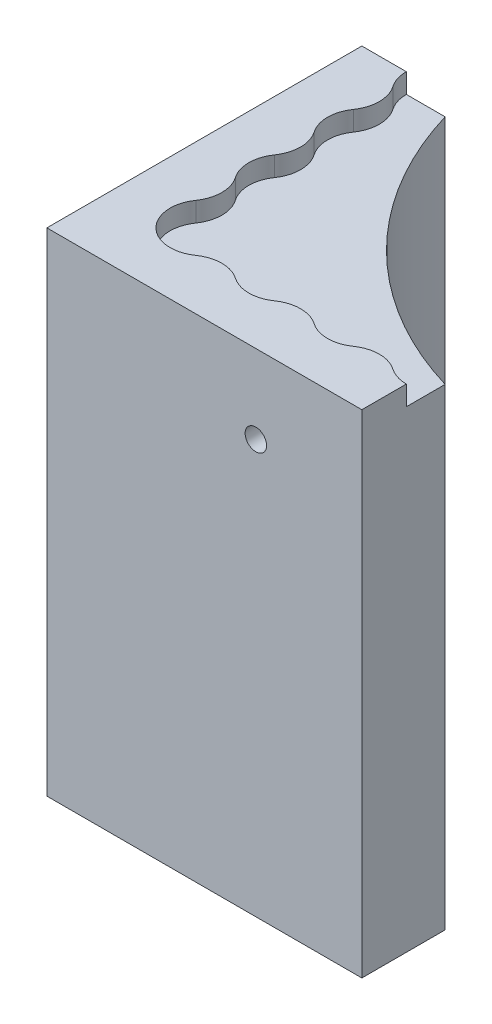
ISO-10303-21;
HEADER;
FILE_DESCRIPTION(('STEP AP214'),'2;1');
FILE_NAME('part.step','',(''),(''),'','','');
FILE_SCHEMA(('AUTOMOTIVE_DESIGN { 1 0 10303 214 1 1 1 1 }'));
ENDSEC;
DATA;
#1=APPLICATION_CONTEXT('core data for automotive mechanical design processes');
#2=APPLICATION_PROTOCOL_DEFINITION('international standard','automotive_design',2000,#1);
#3=PRODUCT_CONTEXT('',#1,'mechanical');
#4=PRODUCT('Part','Part','',(#3));
#5=PRODUCT_RELATED_PRODUCT_CATEGORY('part','',(#4));
#6=PRODUCT_DEFINITION_FORMATION('','',#4);
#7=PRODUCT_DEFINITION_CONTEXT('part definition',#1,'design');
#8=PRODUCT_DEFINITION('design','',#6,#7);
#9=PRODUCT_DEFINITION_SHAPE('','',#8);
#10=(LENGTH_UNIT() NAMED_UNIT(*) SI_UNIT(.MILLI.,.METRE.));
#11=(NAMED_UNIT(*) PLANE_ANGLE_UNIT() SI_UNIT($,.RADIAN.));
#12=(NAMED_UNIT(*) SI_UNIT($,.STERADIAN.) SOLID_ANGLE_UNIT());
#13=UNCERTAINTY_MEASURE_WITH_UNIT(LENGTH_MEASURE(1.E-05),#10,'distance_accuracy_value','');
#14=(GEOMETRIC_REPRESENTATION_CONTEXT(3) GLOBAL_UNCERTAINTY_ASSIGNED_CONTEXT((#13)) GLOBAL_UNIT_ASSIGNED_CONTEXT((#10,
#11,#12)) REPRESENTATION_CONTEXT('',''));
#15=CARTESIAN_POINT('',(0.,0.,0.));
#16=DIRECTION('',(0.,0.,1.));
#17=DIRECTION('',(1.,0.,0.));
#18=AXIS2_PLACEMENT_3D('',#15,#16,#17);
#19=CARTESIAN_POINT('',(0.,79.375,0.));
#20=DIRECTION('',(1.,0.,0.));
#21=DIRECTION('',(0.,0.,-1.));
#22=AXIS2_PLACEMENT_3D('',#19,#20,#21);
#23=PLANE('',#22);
#24=CARTESIAN_POINT('',(1.05619764983864E-13,66.6750000000001,-33.7000000000002));
#25=DIRECTION('',(-1.,0.,0.));
#26=DIRECTION('',(0.,0.,1.));
#27=AXIS2_PLACEMENT_3D('',#24,#25,#26);
#28=CIRCLE('',#27,1.7272);
#29=CARTESIAN_POINT('',(1.05471727593493E-13,66.6750000000001,-31.9728000000002));
#30=VERTEX_POINT('',#29);
#31=EDGE_CURVE('E217',#30,#30,#28,.T.);
#32=ORIENTED_EDGE('',*,*,#31,.F.);
#33=EDGE_LOOP('',(#32));
#34=FACE_BOUND('',#33,.T.);
#35=DIRECTION('',(0.,0.,1.));
#36=VECTOR('',#35,1.);
#37=CARTESIAN_POINT('',(0.,0.,0.));
#38=LINE('',#37,#36);
#39=CARTESIAN_POINT('',(0.,0.,-50.8));
#40=VERTEX_POINT('',#39);
#41=CARTESIAN_POINT('',(0.,0.,0.));
#42=VERTEX_POINT('',#41);
#43=EDGE_CURVE('E375',#40,#42,#38,.T.);
#44=ORIENTED_EDGE('',*,*,#43,.T.);
#45=DIRECTION('',(0.,-1.,0.));
#46=VECTOR('',#45,1.);
#47=CARTESIAN_POINT('',(0.,79.375,0.));
#48=LINE('',#47,#46);
#49=CARTESIAN_POINT('',(0.,79.375,0.));
#50=VERTEX_POINT('',#49);
#51=EDGE_CURVE('E409',#50,#42,#48,.T.);
#52=ORIENTED_EDGE('',*,*,#51,.F.);
#53=DIRECTION('',(0.,0.,1.));
#54=VECTOR('',#53,1.);
#55=CARTESIAN_POINT('',(0.,79.375,0.));
#56=LINE('',#55,#54);
#57=CARTESIAN_POINT('',(0.,79.375,-50.8));
#58=VERTEX_POINT('',#57);
#59=EDGE_CURVE('E376',#58,#50,#56,.T.);
#60=ORIENTED_EDGE('',*,*,#59,.F.);
#61=DIRECTION('',(0.,-1.,0.));
#62=VECTOR('',#61,1.);
#63=CARTESIAN_POINT('',(0.,79.375,-50.8));
#64=LINE('',#63,#62);
#65=EDGE_CURVE('E389',#58,#40,#64,.T.);
#66=ORIENTED_EDGE('',*,*,#65,.T.);
#67=EDGE_LOOP('',(#44,#52,#60,#66));
#68=FACE_BOUND('',#67,.T.);
#69=ADVANCED_FACE('F44',(#34,#68),#23,.F.);
#70=CARTESIAN_POINT('',(0.,79.375,0.));
#71=DIRECTION('',(0.,0.,-1.));
#72=DIRECTION('',(-1.,0.,0.));
#73=AXIS2_PLACEMENT_3D('',#70,#71,#72);
#74=PLANE('',#73);
#75=CARTESIAN_POINT('',(33.7,66.6750000000001,2.22080376858034E-13));
#76=DIRECTION('',(0.,0.,1.));
#77=DIRECTION('',(1.,0.,0.));
#78=AXIS2_PLACEMENT_3D('',#75,#76,#77);
#79=CIRCLE('',#78,1.7272);
#80=CARTESIAN_POINT('',(35.4271999999999,66.6750000000001,2.22080376858034E-13));
#81=VERTEX_POINT('',#80);
#82=EDGE_CURVE('E216',#81,#81,#79,.T.);
#83=ORIENTED_EDGE('',*,*,#82,.F.);
#84=EDGE_LOOP('',(#83));
#85=FACE_BOUND('',#84,.T.);
#86=DIRECTION('',(1.,0.,0.));
#87=VECTOR('',#86,1.);
#88=CARTESIAN_POINT('',(0.,0.,0.));
#89=LINE('',#88,#87);
#90=CARTESIAN_POINT('',(50.8,0.,0.));
#91=VERTEX_POINT('',#90);
#92=EDGE_CURVE('E393',#42,#91,#89,.T.);
#93=ORIENTED_EDGE('',*,*,#92,.T.);
#94=DIRECTION('',(0.,-1.,0.));
#95=VECTOR('',#94,1.);
#96=CARTESIAN_POINT('',(50.8,79.375,0.));
#97=LINE('',#96,#95);
#98=CARTESIAN_POINT('',(50.8,79.375,0.));
#99=VERTEX_POINT('',#98);
#100=EDGE_CURVE('E405',#99,#91,#97,.T.);
#101=ORIENTED_EDGE('',*,*,#100,.F.);
#102=DIRECTION('',(1.,0.,0.));
#103=VECTOR('',#102,1.);
#104=CARTESIAN_POINT('',(0.,79.375,0.));
#105=LINE('',#104,#103);
#106=EDGE_CURVE('E379',#50,#99,#105,.T.);
#107=ORIENTED_EDGE('',*,*,#106,.F.);
#108=ORIENTED_EDGE('',*,*,#51,.T.);
#109=EDGE_LOOP('',(#93,#101,#107,#108));
#110=FACE_BOUND('',#109,.T.);
#111=ADVANCED_FACE('F481',(#85,#110),#74,.F.);
#112=CARTESIAN_POINT('',(50.8,79.375,0.));
#113=DIRECTION('',(-1.,0.,0.));
#114=DIRECTION('',(0.,0.,1.));
#115=AXIS2_PLACEMENT_3D('',#112,#113,#114);
#116=PLANE('',#115);
#117=DIRECTION('',(0.,0.,-1.));
#118=VECTOR('',#117,1.);
#119=CARTESIAN_POINT('',(50.8,0.,0.));
#120=LINE('',#119,#118);
#121=CARTESIAN_POINT('',(50.8,0.,-13.4286312857863));
#122=VERTEX_POINT('',#121);
#123=EDGE_CURVE('E396',#91,#122,#120,.T.);
#124=ORIENTED_EDGE('',*,*,#123,.T.);
#125=DIRECTION('',(0.,1.,0.));
#126=VECTOR('',#125,1.);
#127=CARTESIAN_POINT('',(50.8,0.,-13.4286312857863));
#128=LINE('',#127,#126);
#129=CARTESIAN_POINT('',(50.8,76.2,-13.4286312857863));
#130=VERTEX_POINT('',#129);
#131=EDGE_CURVE('E235',#122,#130,#128,.T.);
#132=ORIENTED_EDGE('',*,*,#131,.T.);
#133=DIRECTION('',(0.,0.,-1.));
#134=VECTOR('',#133,1.);
#135=CARTESIAN_POINT('',(50.8,76.2,0.));
#136=LINE('',#135,#134);
#137=CARTESIAN_POINT('',(50.8,76.2,-7.17550000000003));
#138=VERTEX_POINT('',#137);
#139=EDGE_CURVE('E371',#138,#130,#136,.T.);
#140=ORIENTED_EDGE('',*,*,#139,.F.);
#141=DIRECTION('',(0.,1.,0.));
#142=VECTOR('',#141,1.);
#143=CARTESIAN_POINT('',(50.8,76.2,-7.17550000000003));
#144=LINE('',#143,#142);
#145=CARTESIAN_POINT('',(50.8,79.375,-7.17550000000003));
#146=VERTEX_POINT('',#145);
#147=EDGE_CURVE('E367',#138,#146,#144,.T.);
#148=ORIENTED_EDGE('',*,*,#147,.T.);
#149=DIRECTION('',(0.,0.,-1.));
#150=VECTOR('',#149,1.);
#151=CARTESIAN_POINT('',(50.8,79.375,0.));
#152=LINE('',#151,#150);
#153=EDGE_CURVE('E383',#99,#146,#152,.T.);
#154=ORIENTED_EDGE('',*,*,#153,.F.);
#155=ORIENTED_EDGE('',*,*,#100,.T.);
#156=EDGE_LOOP('',(#124,#132,#140,#148,#154,#155));
#157=FACE_BOUND('',#156,.T.);
#158=ADVANCED_FACE('F478',(#157),#116,.F.);
#159=CARTESIAN_POINT('',(0.,79.375,-50.8));
#160=DIRECTION('',(0.,0.,1.));
#161=DIRECTION('',(1.,0.,0.));
#162=AXIS2_PLACEMENT_3D('',#159,#160,#161);
#163=PLANE('',#162);
#164=DIRECTION('',(-1.,0.,0.));
#165=VECTOR('',#164,1.);
#166=CARTESIAN_POINT('',(0.,76.2,-50.8));
#167=LINE('',#166,#165);
#168=CARTESIAN_POINT('',(13.4286312857863,76.2,-50.8));
#169=VERTEX_POINT('',#168);
#170=CARTESIAN_POINT('',(7.17550000000002,76.2,-50.8));
#171=VERTEX_POINT('',#170);
#172=EDGE_CURVE('E52',#169,#171,#167,.T.);
#173=ORIENTED_EDGE('',*,*,#172,.F.);
#174=DIRECTION('',(0.,1.,0.));
#175=VECTOR('',#174,1.);
#176=CARTESIAN_POINT('',(13.4286312857863,0.,-50.8));
#177=LINE('',#176,#175);
#178=CARTESIAN_POINT('',(13.4286312857863,0.,-50.8));
#179=VERTEX_POINT('',#178);
#180=EDGE_CURVE('E58',#169,#179,#177,.F.);
#181=ORIENTED_EDGE('',*,*,#180,.T.);
#182=DIRECTION('',(-1.,0.,0.));
#183=VECTOR('',#182,1.);
#184=CARTESIAN_POINT('',(0.,0.,-50.8));
#185=LINE('',#184,#183);
#186=EDGE_CURVE('E380',#179,#40,#185,.T.);
#187=ORIENTED_EDGE('',*,*,#186,.T.);
#188=ORIENTED_EDGE('',*,*,#65,.F.);
#189=DIRECTION('',(-1.,0.,0.));
#190=VECTOR('',#189,1.);
#191=CARTESIAN_POINT('',(0.,79.375,-50.8));
#192=LINE('',#191,#190);
#193=CARTESIAN_POINT('',(7.17550000000002,79.375,-50.8));
#194=VERTEX_POINT('',#193);
#195=EDGE_CURVE('E387',#194,#58,#192,.T.);
#196=ORIENTED_EDGE('',*,*,#195,.F.);
#197=DIRECTION('',(0.,1.,0.));
#198=VECTOR('',#197,1.);
#199=CARTESIAN_POINT('',(7.17550000000002,76.2,-50.8));
#200=LINE('',#199,#198);
#201=EDGE_CURVE('E66',#194,#171,#200,.F.);
#202=ORIENTED_EDGE('',*,*,#201,.T.);
#203=EDGE_LOOP('',(#173,#181,#187,#188,#196,#202));
#204=FACE_BOUND('',#203,.T.);
#205=ADVANCED_FACE('F422',(#204),#163,.F.);
#206=CARTESIAN_POINT('',(0.,79.375,0.));
#207=DIRECTION('',(0.,-1.,0.));
#208=DIRECTION('',(0.,0.,-1.));
#209=AXIS2_PLACEMENT_3D('',#206,#207,#208);
#210=PLANE('',#209);
#211=ORIENTED_EDGE('',*,*,#153,.T.);
#212=CARTESIAN_POINT('',(50.8,79.375,-12.7));
#213=DIRECTION('',(0.,1.,0.));
#214=DIRECTION('',(0.,0.,1.));
#215=AXIS2_PLACEMENT_3D('',#212,#213,#214);
#216=CIRCLE('',#215,5.5245);
#217=CARTESIAN_POINT('',(47.6431428571429,79.375,-8.16630909417155));
#218=VERTEX_POINT('',#217);
#219=EDGE_CURVE('E243',#218,#146,#216,.T.);
#220=ORIENTED_EDGE('',*,*,#219,.F.);
#221=CARTESIAN_POINT('',(44.45,79.375,-3.58050679862091));
#222=DIRECTION('',(0.,-1.,0.));
#223=DIRECTION('',(0.,0.,1.));
#224=AXIS2_PLACEMENT_3D('',#221,#222,#223);
#225=CIRCLE('',#224,5.588);
#226=CARTESIAN_POINT('',(41.2568571428572,79.375,-8.16630909417154));
#227=VERTEX_POINT('',#226);
#228=EDGE_CURVE('E327',#227,#218,#225,.T.);
#229=ORIENTED_EDGE('',*,*,#228,.F.);
#230=CARTESIAN_POINT('',(38.1,79.375,-12.7));
#231=DIRECTION('',(0.,1.,0.));
#232=DIRECTION('',(0.,0.,1.));
#233=AXIS2_PLACEMENT_3D('',#230,#231,#232);
#234=CIRCLE('',#233,5.5245);
#235=CARTESIAN_POINT('',(34.9431428571429,79.375,-8.16630909417153));
#236=VERTEX_POINT('',#235);
#237=EDGE_CURVE('E323',#236,#227,#234,.T.);
#238=ORIENTED_EDGE('',*,*,#237,.F.);
#239=CARTESIAN_POINT('',(31.75,79.375,-3.58050679862088));
#240=DIRECTION('',(0.,-1.,0.));
#241=DIRECTION('',(0.,0.,1.));
#242=AXIS2_PLACEMENT_3D('',#239,#240,#241);
#243=CIRCLE('',#242,5.588);
#244=CARTESIAN_POINT('',(28.5568571428572,79.375,-8.16630909417152));
#245=VERTEX_POINT('',#244);
#246=EDGE_CURVE('E319',#245,#236,#243,.T.);
#247=ORIENTED_EDGE('',*,*,#246,.F.);
#248=CARTESIAN_POINT('',(25.4,79.375,-12.7));
#249=DIRECTION('',(0.,1.,0.));
#250=DIRECTION('',(0.,0.,1.));
#251=AXIS2_PLACEMENT_3D('',#248,#249,#250);
#252=CIRCLE('',#251,5.5245);
#253=CARTESIAN_POINT('',(22.2431428571429,79.375,-8.16630909417153));
#254=VERTEX_POINT('',#253);
#255=EDGE_CURVE('E315',#254,#245,#252,.T.);
#256=ORIENTED_EDGE('',*,*,#255,.F.);
#257=CARTESIAN_POINT('',(19.05,79.375,-3.58050679862087));
#258=DIRECTION('',(0.,-1.,0.));
#259=DIRECTION('',(0.,0.,1.));
#260=AXIS2_PLACEMENT_3D('',#257,#258,#259);
#261=CIRCLE('',#260,5.588);
#262=CARTESIAN_POINT('',(15.8568571428572,79.375,-8.16630909417152));
#263=VERTEX_POINT('',#262);
#264=EDGE_CURVE('E311',#263,#254,#261,.T.);
#265=ORIENTED_EDGE('',*,*,#264,.F.);
#266=CARTESIAN_POINT('',(12.7,79.375,-12.7));
#267=DIRECTION('',(0.,1.,0.));
#268=DIRECTION('',(0.,0.,1.));
#269=AXIS2_PLACEMENT_3D('',#266,#267,#268);
#270=CIRCLE('',#269,5.5245);
#271=CARTESIAN_POINT('',(8.16630909417153,79.375,-15.8568571428571));
#272=VERTEX_POINT('',#271);
#273=EDGE_CURVE('E307',#272,#263,#270,.T.);
#274=ORIENTED_EDGE('',*,*,#273,.F.);
#275=CARTESIAN_POINT('',(3.58050679862089,79.375,-19.05));
#276=DIRECTION('',(0.,-1.,0.));
#277=DIRECTION('',(0.,0.,1.));
#278=AXIS2_PLACEMENT_3D('',#275,#276,#277);
#279=CIRCLE('',#278,5.588);
#280=CARTESIAN_POINT('',(8.16630909417154,79.375,-22.2431428571428));
#281=VERTEX_POINT('',#280);
#282=EDGE_CURVE('E303',#281,#272,#279,.T.);
#283=ORIENTED_EDGE('',*,*,#282,.F.);
#284=CARTESIAN_POINT('',(12.7,79.375,-25.4));
#285=DIRECTION('',(0.,1.,0.));
#286=DIRECTION('',(0.,0.,1.));
#287=AXIS2_PLACEMENT_3D('',#284,#285,#286);
#288=CIRCLE('',#287,5.5245);
#289=CARTESIAN_POINT('',(8.16630909417154,79.375,-28.5568571428571));
#290=VERTEX_POINT('',#289);
#291=EDGE_CURVE('E299',#290,#281,#288,.T.);
#292=ORIENTED_EDGE('',*,*,#291,.F.);
#293=CARTESIAN_POINT('',(3.5805067986209,79.375,-31.75));
#294=DIRECTION('',(0.,-1.,0.));
#295=DIRECTION('',(0.,0.,1.));
#296=AXIS2_PLACEMENT_3D('',#293,#294,#295);
#297=CIRCLE('',#296,5.588);
#298=CARTESIAN_POINT('',(8.16630909417155,79.375,-34.9431428571428));
#299=VERTEX_POINT('',#298);
#300=EDGE_CURVE('E295',#299,#290,#297,.T.);
#301=ORIENTED_EDGE('',*,*,#300,.F.);
#302=CARTESIAN_POINT('',(12.7,79.375,-38.1));
#303=DIRECTION('',(0.,1.,0.));
#304=DIRECTION('',(0.,0.,1.));
#305=AXIS2_PLACEMENT_3D('',#302,#303,#304);
#306=CIRCLE('',#305,5.5245);
#307=CARTESIAN_POINT('',(8.16630909417156,79.375,-41.2568571428571));
#308=VERTEX_POINT('',#307);
#309=EDGE_CURVE('E292',#308,#299,#306,.T.);
#310=ORIENTED_EDGE('',*,*,#309,.F.);
#311=CARTESIAN_POINT('',(3.58050679862091,79.375,-44.45));
#312=DIRECTION('',(0.,-1.,0.));
#313=DIRECTION('',(0.,0.,1.));
#314=AXIS2_PLACEMENT_3D('',#311,#312,#313);
#315=CIRCLE('',#314,5.588);
#316=CARTESIAN_POINT('',(8.16630909417155,79.375,-47.6431428571429));
#317=VERTEX_POINT('',#316);
#318=EDGE_CURVE('E239',#317,#308,#315,.T.);
#319=ORIENTED_EDGE('',*,*,#318,.F.);
#320=CARTESIAN_POINT('',(12.7,79.375,-50.8));
#321=DIRECTION('',(0.,-1.,0.));
#322=DIRECTION('',(0.,0.,-1.));
#323=AXIS2_PLACEMENT_3D('',#320,#321,#322);
#324=CIRCLE('',#323,5.5245);
#325=EDGE_CURVE('E413',#317,#194,#324,.T.);
#326=ORIENTED_EDGE('',*,*,#325,.T.);
#327=ORIENTED_EDGE('',*,*,#195,.T.);
#328=ORIENTED_EDGE('',*,*,#59,.T.);
#329=ORIENTED_EDGE('',*,*,#106,.T.);
#330=EDGE_LOOP('',(#211,#220,#229,#238,#247,#256,#265,#274,#283,#292,#301,#310,#319,#326,#327,
#328,#329));
#331=FACE_BOUND('',#330,.T.);
#332=ADVANCED_FACE('F426',(#331),#210,.F.);
#333=CARTESIAN_POINT('',(0.,0.,0.));
#334=DIRECTION('',(0.,-1.,0.));
#335=DIRECTION('',(0.,0.,-1.));
#336=AXIS2_PLACEMENT_3D('',#333,#334,#335);
#337=PLANE('',#336);
#338=CARTESIAN_POINT('',(66.675,0.,-66.675));
#339=DIRECTION('',(0.,1.,0.));
#340=DIRECTION('',(0.,0.,1.));
#341=AXIS2_PLACEMENT_3D('',#338,#339,#340);
#342=CIRCLE('',#341,55.5625);
#343=EDGE_CURVE('E229',#179,#122,#342,.T.);
#344=ORIENTED_EDGE('',*,*,#343,.T.);
#345=ORIENTED_EDGE('',*,*,#123,.F.);
#346=ORIENTED_EDGE('',*,*,#92,.F.);
#347=ORIENTED_EDGE('',*,*,#43,.F.);
#348=ORIENTED_EDGE('',*,*,#186,.F.);
#349=EDGE_LOOP('',(#344,#345,#346,#347,#348));
#350=FACE_BOUND('',#349,.T.);
#351=ADVANCED_FACE('F484',(#350),#337,.T.);
#352=CARTESIAN_POINT('',(124.51538150761,76.2,-124.51538150761));
#353=DIRECTION('',(0.,1.,0.));
#354=DIRECTION('',(0.,0.,1.));
#355=AXIS2_PLACEMENT_3D('',#352,#353,#354);
#356=PLANE('',#355);
#357=CARTESIAN_POINT('',(66.675,76.2,-66.675));
#358=DIRECTION('',(0.,1.,0.));
#359=DIRECTION('',(0.,0.,1.));
#360=AXIS2_PLACEMENT_3D('',#357,#358,#359);
#361=CIRCLE('',#360,55.5625);
#362=EDGE_CURVE('E11',#169,#130,#361,.T.);
#363=ORIENTED_EDGE('',*,*,#362,.F.);
#364=ORIENTED_EDGE('',*,*,#172,.T.);
#365=CARTESIAN_POINT('',(12.7,76.2,-50.8));
#366=DIRECTION('',(0.,1.,0.));
#367=DIRECTION('',(0.,0.,1.));
#368=AXIS2_PLACEMENT_3D('',#365,#366,#367);
#369=CIRCLE('',#368,5.5245);
#370=CARTESIAN_POINT('',(8.16630909417155,76.2,-47.6431428571429));
#371=VERTEX_POINT('',#370);
#372=EDGE_CURVE('E240',#171,#371,#369,.T.);
#373=ORIENTED_EDGE('',*,*,#372,.T.);
#374=CARTESIAN_POINT('',(3.58050679862091,76.2,-44.45));
#375=DIRECTION('',(0.,-1.,0.));
#376=DIRECTION('',(0.,0.,1.));
#377=AXIS2_PLACEMENT_3D('',#374,#375,#376);
#378=CIRCLE('',#377,5.588);
#379=CARTESIAN_POINT('',(8.16630909417156,76.2,-41.2568571428571));
#380=VERTEX_POINT('',#379);
#381=EDGE_CURVE('E242',#371,#380,#378,.T.);
#382=ORIENTED_EDGE('',*,*,#381,.T.);
#383=CARTESIAN_POINT('',(12.7,76.2,-38.1));
#384=DIRECTION('',(0.,1.,0.));
#385=DIRECTION('',(0.,0.,1.));
#386=AXIS2_PLACEMENT_3D('',#383,#384,#385);
#387=CIRCLE('',#386,5.5245);
#388=CARTESIAN_POINT('',(8.16630909417155,76.2,-34.9431428571428));
#389=VERTEX_POINT('',#388);
#390=EDGE_CURVE('E246',#380,#389,#387,.T.);
#391=ORIENTED_EDGE('',*,*,#390,.T.);
#392=CARTESIAN_POINT('',(3.5805067986209,76.2,-31.75));
#393=DIRECTION('',(0.,-1.,0.));
#394=DIRECTION('',(0.,0.,1.));
#395=AXIS2_PLACEMENT_3D('',#392,#393,#394);
#396=CIRCLE('',#395,5.588);
#397=CARTESIAN_POINT('',(8.16630909417154,76.2,-28.5568571428571));
#398=VERTEX_POINT('',#397);
#399=EDGE_CURVE('E249',#389,#398,#396,.T.);
#400=ORIENTED_EDGE('',*,*,#399,.T.);
#401=CARTESIAN_POINT('',(12.7,76.2,-25.4));
#402=DIRECTION('',(0.,1.,0.));
#403=DIRECTION('',(0.,0.,1.));
#404=AXIS2_PLACEMENT_3D('',#401,#402,#403);
#405=CIRCLE('',#404,5.5245);
#406=CARTESIAN_POINT('',(8.16630909417154,76.2,-22.2431428571428));
#407=VERTEX_POINT('',#406);
#408=EDGE_CURVE('E253',#398,#407,#405,.T.);
#409=ORIENTED_EDGE('',*,*,#408,.T.);
#410=CARTESIAN_POINT('',(3.58050679862089,76.2,-19.05));
#411=DIRECTION('',(0.,-1.,0.));
#412=DIRECTION('',(0.,0.,1.));
#413=AXIS2_PLACEMENT_3D('',#410,#411,#412);
#414=CIRCLE('',#413,5.588);
#415=CARTESIAN_POINT('',(8.16630909417153,76.2,-15.8568571428571));
#416=VERTEX_POINT('',#415);
#417=EDGE_CURVE('E257',#407,#416,#414,.T.);
#418=ORIENTED_EDGE('',*,*,#417,.T.);
#419=CARTESIAN_POINT('',(12.7,76.2,-12.7));
#420=DIRECTION('',(0.,1.,0.));
#421=DIRECTION('',(0.,0.,1.));
#422=AXIS2_PLACEMENT_3D('',#419,#420,#421);
#423=CIRCLE('',#422,5.5245);
#424=CARTESIAN_POINT('',(15.8568571428572,76.2,-8.16630909417152));
#425=VERTEX_POINT('',#424);
#426=EDGE_CURVE('E261',#416,#425,#423,.T.);
#427=ORIENTED_EDGE('',*,*,#426,.T.);
#428=CARTESIAN_POINT('',(19.05,76.2,-3.58050679862087));
#429=DIRECTION('',(0.,-1.,0.));
#430=DIRECTION('',(0.,0.,1.));
#431=AXIS2_PLACEMENT_3D('',#428,#429,#430);
#432=CIRCLE('',#431,5.588);
#433=CARTESIAN_POINT('',(22.2431428571429,76.2,-8.16630909417153));
#434=VERTEX_POINT('',#433);
#435=EDGE_CURVE('E265',#425,#434,#432,.T.);
#436=ORIENTED_EDGE('',*,*,#435,.T.);
#437=CARTESIAN_POINT('',(25.4,76.2,-12.7));
#438=DIRECTION('',(0.,1.,0.));
#439=DIRECTION('',(0.,0.,1.));
#440=AXIS2_PLACEMENT_3D('',#437,#438,#439);
#441=CIRCLE('',#440,5.5245);
#442=CARTESIAN_POINT('',(28.5568571428572,76.2,-8.16630909417152));
#443=VERTEX_POINT('',#442);
#444=EDGE_CURVE('E269',#434,#443,#441,.T.);
#445=ORIENTED_EDGE('',*,*,#444,.T.);
#446=CARTESIAN_POINT('',(31.75,76.2,-3.58050679862088));
#447=DIRECTION('',(0.,-1.,0.));
#448=DIRECTION('',(0.,0.,1.));
#449=AXIS2_PLACEMENT_3D('',#446,#447,#448);
#450=CIRCLE('',#449,5.588);
#451=CARTESIAN_POINT('',(34.9431428571429,76.2,-8.16630909417153));
#452=VERTEX_POINT('',#451);
#453=EDGE_CURVE('E273',#443,#452,#450,.T.);
#454=ORIENTED_EDGE('',*,*,#453,.T.);
#455=CARTESIAN_POINT('',(38.1,76.2,-12.7));
#456=DIRECTION('',(0.,1.,0.));
#457=DIRECTION('',(0.,0.,1.));
#458=AXIS2_PLACEMENT_3D('',#455,#456,#457);
#459=CIRCLE('',#458,5.5245);
#460=CARTESIAN_POINT('',(41.2568571428572,76.2,-8.16630909417154));
#461=VERTEX_POINT('',#460);
#462=EDGE_CURVE('E277',#452,#461,#459,.T.);
#463=ORIENTED_EDGE('',*,*,#462,.T.);
#464=CARTESIAN_POINT('',(44.45,76.2,-3.58050679862091));
#465=DIRECTION('',(0.,-1.,0.));
#466=DIRECTION('',(0.,0.,1.));
#467=AXIS2_PLACEMENT_3D('',#464,#465,#466);
#468=CIRCLE('',#467,5.588);
#469=CARTESIAN_POINT('',(47.6431428571429,76.2,-8.16630909417155));
#470=VERTEX_POINT('',#469);
#471=EDGE_CURVE('E281',#461,#470,#468,.T.);
#472=ORIENTED_EDGE('',*,*,#471,.T.);
#473=CARTESIAN_POINT('',(50.8,76.2,-12.7));
#474=DIRECTION('',(0.,1.,0.));
#475=DIRECTION('',(0.,0.,1.));
#476=AXIS2_PLACEMENT_3D('',#473,#474,#475);
#477=CIRCLE('',#476,5.5245);
#478=EDGE_CURVE('E285',#470,#138,#477,.T.);
#479=ORIENTED_EDGE('',*,*,#478,.T.);
#480=ORIENTED_EDGE('',*,*,#139,.T.);
#481=EDGE_LOOP('',(#363,#364,#373,#382,#391,#400,#409,#418,#427,#436,#445,#454,#463,#472,#479,#480));
#482=FACE_BOUND('',#481,.T.);
#483=ADVANCED_FACE('F416',(#482),#356,.T.);
#484=CARTESIAN_POINT('',(50.8,76.2,-12.7));
#485=DIRECTION('',(0.,1.,0.));
#486=DIRECTION('',(0.,0.,1.));
#487=AXIS2_PLACEMENT_3D('',#484,#485,#486);
#488=CYLINDRICAL_SURFACE('',#487,5.5245);
#489=ORIENTED_EDGE('',*,*,#478,.F.);
#490=DIRECTION('',(0.,1.,0.));
#491=VECTOR('',#490,1.);
#492=CARTESIAN_POINT('',(47.6431428571429,76.2,-8.16630909417155));
#493=LINE('',#492,#491);
#494=EDGE_CURVE('E333',#470,#218,#493,.T.);
#495=ORIENTED_EDGE('',*,*,#494,.T.);
#496=ORIENTED_EDGE('',*,*,#219,.T.);
#497=ORIENTED_EDGE('',*,*,#147,.F.);
#498=EDGE_LOOP('',(#489,#495,#496,#497));
#499=FACE_BOUND('',#498,.T.);
#500=ADVANCED_FACE('F475',(#499),#488,.F.);
#501=CARTESIAN_POINT('',(12.7,76.2,-50.8));
#502=DIRECTION('',(0.,1.,0.));
#503=DIRECTION('',(0.,0.,1.));
#504=AXIS2_PLACEMENT_3D('',#501,#502,#503);
#505=CYLINDRICAL_SURFACE('',#504,5.5245);
#506=ORIENTED_EDGE('',*,*,#325,.F.);
#507=DIRECTION('',(0.,1.,0.));
#508=VECTOR('',#507,1.);
#509=CARTESIAN_POINT('',(8.16630909417155,76.2,-47.6431428571429));
#510=LINE('',#509,#508);
#511=EDGE_CURVE('E289',#371,#317,#510,.T.);
#512=ORIENTED_EDGE('',*,*,#511,.F.);
#513=ORIENTED_EDGE('',*,*,#372,.F.);
#514=ORIENTED_EDGE('',*,*,#201,.F.);
#515=EDGE_LOOP('',(#506,#512,#513,#514));
#516=FACE_BOUND('',#515,.T.);
#517=ADVANCED_FACE('F419',(#516),#505,.F.);
#518=CARTESIAN_POINT('',(44.45,76.2,-3.58050679862091));
#519=DIRECTION('',(0.,1.,0.));
#520=DIRECTION('',(0.,0.,1.));
#521=AXIS2_PLACEMENT_3D('',#518,#519,#520);
#522=CYLINDRICAL_SURFACE('',#521,5.588);
#523=ORIENTED_EDGE('',*,*,#228,.T.);
#524=ORIENTED_EDGE('',*,*,#494,.F.);
#525=ORIENTED_EDGE('',*,*,#471,.F.);
#526=DIRECTION('',(0.,1.,0.));
#527=VECTOR('',#526,1.);
#528=CARTESIAN_POINT('',(41.2568571428572,76.2,-8.16630909417154));
#529=LINE('',#528,#527);
#530=EDGE_CURVE('E336',#461,#227,#529,.T.);
#531=ORIENTED_EDGE('',*,*,#530,.T.);
#532=EDGE_LOOP('',(#523,#524,#525,#531));
#533=FACE_BOUND('',#532,.T.);
#534=ADVANCED_FACE('F471',(#533),#522,.T.);
#535=CARTESIAN_POINT('',(38.1,76.2,-12.7));
#536=DIRECTION('',(0.,1.,0.));
#537=DIRECTION('',(0.,0.,1.));
#538=AXIS2_PLACEMENT_3D('',#535,#536,#537);
#539=CYLINDRICAL_SURFACE('',#538,5.5245);
#540=ORIENTED_EDGE('',*,*,#237,.T.);
#541=ORIENTED_EDGE('',*,*,#530,.F.);
#542=ORIENTED_EDGE('',*,*,#462,.F.);
#543=DIRECTION('',(0.,1.,0.));
#544=VECTOR('',#543,1.);
#545=CARTESIAN_POINT('',(34.9431428571429,76.2,-8.16630909417153));
#546=LINE('',#545,#544);
#547=EDGE_CURVE('E339',#452,#236,#546,.T.);
#548=ORIENTED_EDGE('',*,*,#547,.T.);
#549=EDGE_LOOP('',(#540,#541,#542,#548));
#550=FACE_BOUND('',#549,.T.);
#551=ADVANCED_FACE('F466',(#550),#539,.F.);
#552=CARTESIAN_POINT('',(31.75,76.2,-3.58050679862088));
#553=DIRECTION('',(0.,1.,0.));
#554=DIRECTION('',(0.,0.,1.));
#555=AXIS2_PLACEMENT_3D('',#552,#553,#554);
#556=CYLINDRICAL_SURFACE('',#555,5.588);
#557=ORIENTED_EDGE('',*,*,#246,.T.);
#558=ORIENTED_EDGE('',*,*,#547,.F.);
#559=ORIENTED_EDGE('',*,*,#453,.F.);
#560=DIRECTION('',(0.,1.,0.));
#561=VECTOR('',#560,1.);
#562=CARTESIAN_POINT('',(28.5568571428572,76.2,-8.16630909417152));
#563=LINE('',#562,#561);
#564=EDGE_CURVE('E342',#443,#245,#563,.T.);
#565=ORIENTED_EDGE('',*,*,#564,.T.);
#566=EDGE_LOOP('',(#557,#558,#559,#565));
#567=FACE_BOUND('',#566,.T.);
#568=ADVANCED_FACE('F462',(#567),#556,.T.);
#569=CARTESIAN_POINT('',(25.4,76.2,-12.7));
#570=DIRECTION('',(0.,1.,0.));
#571=DIRECTION('',(0.,0.,1.));
#572=AXIS2_PLACEMENT_3D('',#569,#570,#571);
#573=CYLINDRICAL_SURFACE('',#572,5.5245);
#574=ORIENTED_EDGE('',*,*,#255,.T.);
#575=ORIENTED_EDGE('',*,*,#564,.F.);
#576=ORIENTED_EDGE('',*,*,#444,.F.);
#577=DIRECTION('',(0.,1.,0.));
#578=VECTOR('',#577,1.);
#579=CARTESIAN_POINT('',(22.2431428571429,76.2,-8.16630909417153));
#580=LINE('',#579,#578);
#581=EDGE_CURVE('E345',#434,#254,#580,.T.);
#582=ORIENTED_EDGE('',*,*,#581,.T.);
#583=EDGE_LOOP('',(#574,#575,#576,#582));
#584=FACE_BOUND('',#583,.T.);
#585=ADVANCED_FACE('F458',(#584),#573,.F.);
#586=CARTESIAN_POINT('',(19.05,76.2,-3.58050679862087));
#587=DIRECTION('',(0.,1.,0.));
#588=DIRECTION('',(0.,0.,1.));
#589=AXIS2_PLACEMENT_3D('',#586,#587,#588);
#590=CYLINDRICAL_SURFACE('',#589,5.588);
#591=ORIENTED_EDGE('',*,*,#264,.T.);
#592=ORIENTED_EDGE('',*,*,#581,.F.);
#593=ORIENTED_EDGE('',*,*,#435,.F.);
#594=DIRECTION('',(0.,1.,0.));
#595=VECTOR('',#594,1.);
#596=CARTESIAN_POINT('',(15.8568571428572,76.2,-8.16630909417152));
#597=LINE('',#596,#595);
#598=EDGE_CURVE('E348',#425,#263,#597,.T.);
#599=ORIENTED_EDGE('',*,*,#598,.T.);
#600=EDGE_LOOP('',(#591,#592,#593,#599));
#601=FACE_BOUND('',#600,.T.);
#602=ADVANCED_FACE('F454',(#601),#590,.T.);
#603=CARTESIAN_POINT('',(12.7,76.2,-12.7));
#604=DIRECTION('',(0.,1.,0.));
#605=DIRECTION('',(0.,0.,1.));
#606=AXIS2_PLACEMENT_3D('',#603,#604,#605);
#607=CYLINDRICAL_SURFACE('',#606,5.5245);
#608=ORIENTED_EDGE('',*,*,#273,.T.);
#609=ORIENTED_EDGE('',*,*,#598,.F.);
#610=ORIENTED_EDGE('',*,*,#426,.F.);
#611=DIRECTION('',(0.,1.,0.));
#612=VECTOR('',#611,1.);
#613=CARTESIAN_POINT('',(8.16630909417153,76.2,-15.8568571428571));
#614=LINE('',#613,#612);
#615=EDGE_CURVE('E351',#416,#272,#614,.T.);
#616=ORIENTED_EDGE('',*,*,#615,.T.);
#617=EDGE_LOOP('',(#608,#609,#610,#616));
#618=FACE_BOUND('',#617,.T.);
#619=ADVANCED_FACE('F450',(#618),#607,.F.);
#620=CARTESIAN_POINT('',(3.58050679862089,76.2,-19.05));
#621=DIRECTION('',(0.,1.,0.));
#622=DIRECTION('',(0.,0.,1.));
#623=AXIS2_PLACEMENT_3D('',#620,#621,#622);
#624=CYLINDRICAL_SURFACE('',#623,5.588);
#625=ORIENTED_EDGE('',*,*,#282,.T.);
#626=ORIENTED_EDGE('',*,*,#615,.F.);
#627=ORIENTED_EDGE('',*,*,#417,.F.);
#628=DIRECTION('',(0.,1.,0.));
#629=VECTOR('',#628,1.);
#630=CARTESIAN_POINT('',(8.16630909417154,76.2,-22.2431428571428));
#631=LINE('',#630,#629);
#632=EDGE_CURVE('E354',#407,#281,#631,.T.);
#633=ORIENTED_EDGE('',*,*,#632,.T.);
#634=EDGE_LOOP('',(#625,#626,#627,#633));
#635=FACE_BOUND('',#634,.T.);
#636=ADVANCED_FACE('F446',(#635),#624,.T.);
#637=CARTESIAN_POINT('',(12.7,76.2,-25.4));
#638=DIRECTION('',(0.,1.,0.));
#639=DIRECTION('',(0.,0.,1.));
#640=AXIS2_PLACEMENT_3D('',#637,#638,#639);
#641=CYLINDRICAL_SURFACE('',#640,5.5245);
#642=ORIENTED_EDGE('',*,*,#291,.T.);
#643=ORIENTED_EDGE('',*,*,#632,.F.);
#644=ORIENTED_EDGE('',*,*,#408,.F.);
#645=DIRECTION('',(0.,1.,0.));
#646=VECTOR('',#645,1.);
#647=CARTESIAN_POINT('',(8.16630909417154,76.2,-28.5568571428571));
#648=LINE('',#647,#646);
#649=EDGE_CURVE('E357',#398,#290,#648,.T.);
#650=ORIENTED_EDGE('',*,*,#649,.T.);
#651=EDGE_LOOP('',(#642,#643,#644,#650));
#652=FACE_BOUND('',#651,.T.);
#653=ADVANCED_FACE('F442',(#652),#641,.F.);
#654=CARTESIAN_POINT('',(3.5805067986209,76.2,-31.75));
#655=DIRECTION('',(0.,1.,0.));
#656=DIRECTION('',(0.,0.,1.));
#657=AXIS2_PLACEMENT_3D('',#654,#655,#656);
#658=CYLINDRICAL_SURFACE('',#657,5.588);
#659=ORIENTED_EDGE('',*,*,#300,.T.);
#660=ORIENTED_EDGE('',*,*,#649,.F.);
#661=ORIENTED_EDGE('',*,*,#399,.F.);
#662=DIRECTION('',(0.,1.,0.));
#663=VECTOR('',#662,1.);
#664=CARTESIAN_POINT('',(8.16630909417155,76.2,-34.9431428571428));
#665=LINE('',#664,#663);
#666=EDGE_CURVE('E360',#389,#299,#665,.T.);
#667=ORIENTED_EDGE('',*,*,#666,.T.);
#668=EDGE_LOOP('',(#659,#660,#661,#667));
#669=FACE_BOUND('',#668,.T.);
#670=ADVANCED_FACE('F438',(#669),#658,.T.);
#671=CARTESIAN_POINT('',(12.7,76.2,-38.1));
#672=DIRECTION('',(0.,1.,0.));
#673=DIRECTION('',(0.,0.,1.));
#674=AXIS2_PLACEMENT_3D('',#671,#672,#673);
#675=CYLINDRICAL_SURFACE('',#674,5.5245);
#676=ORIENTED_EDGE('',*,*,#309,.T.);
#677=ORIENTED_EDGE('',*,*,#666,.F.);
#678=ORIENTED_EDGE('',*,*,#390,.F.);
#679=DIRECTION('',(0.,1.,0.));
#680=VECTOR('',#679,1.);
#681=CARTESIAN_POINT('',(8.16630909417156,76.2,-41.2568571428571));
#682=LINE('',#681,#680);
#683=EDGE_CURVE('E362',#380,#308,#682,.T.);
#684=ORIENTED_EDGE('',*,*,#683,.T.);
#685=EDGE_LOOP('',(#676,#677,#678,#684));
#686=FACE_BOUND('',#685,.T.);
#687=ADVANCED_FACE('F435',(#686),#675,.F.);
#688=CARTESIAN_POINT('',(3.58050679862091,76.2,-44.45));
#689=DIRECTION('',(0.,1.,0.));
#690=DIRECTION('',(0.,0.,1.));
#691=AXIS2_PLACEMENT_3D('',#688,#689,#690);
#692=CYLINDRICAL_SURFACE('',#691,5.588);
#693=ORIENTED_EDGE('',*,*,#318,.T.);
#694=ORIENTED_EDGE('',*,*,#683,.F.);
#695=ORIENTED_EDGE('',*,*,#381,.F.);
#696=ORIENTED_EDGE('',*,*,#511,.T.);
#697=EDGE_LOOP('',(#693,#694,#695,#696));
#698=FACE_BOUND('',#697,.T.);
#699=ADVANCED_FACE('F431',(#698),#692,.T.);
#700=CARTESIAN_POINT('',(66.675,0.,-66.675));
#701=DIRECTION('',(0.,1.,0.));
#702=DIRECTION('',(0.,0.,1.));
#703=AXIS2_PLACEMENT_3D('',#700,#701,#702);
#704=CYLINDRICAL_SURFACE('',#703,55.5625);
#705=ORIENTED_EDGE('',*,*,#343,.F.);
#706=ORIENTED_EDGE('',*,*,#180,.F.);
#707=ORIENTED_EDGE('',*,*,#362,.T.);
#708=ORIENTED_EDGE('',*,*,#131,.F.);
#709=EDGE_LOOP('',(#705,#706,#707,#708));
#710=FACE_BOUND('',#709,.T.);
#711=ADVANCED_FACE('F487',(#710),#704,.F.);
#712=CARTESIAN_POINT('',(33.7,66.6750000000001,-10.7086399999998));
#713=DIRECTION('',(0.,0.,1.));
#714=DIRECTION('',(1.,0.,0.));
#715=AXIS2_PLACEMENT_3D('',#712,#713,#714);
#716=CONICAL_SURFACE('',#715,1.7272,1.02974425867665);
#717=CARTESIAN_POINT('',(33.7,66.6750000000001,-11.7464464611842));
#718=VERTEX_POINT('',#717);
#719=VERTEX_LOOP('',#718);
#720=FACE_BOUND('',#719,.T.);
#721=CARTESIAN_POINT('',(33.7,66.6750000000001,-10.7086399999998));
#722=DIRECTION('',(0.,0.,1.));
#723=DIRECTION('',(1.,0.,0.));
#724=AXIS2_PLACEMENT_3D('',#721,#722,#723);
#725=CIRCLE('',#724,1.7272);
#726=CARTESIAN_POINT('',(35.4271999999999,66.6750000000001,-10.7086399999998));
#727=VERTEX_POINT('',#726);
#728=EDGE_CURVE('E221',#727,#727,#725,.T.);
#729=ORIENTED_EDGE('',*,*,#728,.T.);
#730=EDGE_LOOP('',(#729));
#731=FACE_BOUND('',#730,.T.);
#732=ADVANCED_FACE('F505',(#720,#731),#716,.F.);
#733=CARTESIAN_POINT('',(33.7,66.6750000000001,2.22044604925031E-13));
#734=DIRECTION('',(0.,0.,1.));
#735=DIRECTION('',(1.,0.,0.));
#736=AXIS2_PLACEMENT_3D('',#733,#734,#735);
#737=CYLINDRICAL_SURFACE('',#736,1.7272);
#738=ORIENTED_EDGE('',*,*,#728,.F.);
#739=EDGE_LOOP('',(#738));
#740=FACE_BOUND('',#739,.T.);
#741=ORIENTED_EDGE('',*,*,#82,.T.);
#742=EDGE_LOOP('',(#741));
#743=FACE_BOUND('',#742,.T.);
#744=ADVANCED_FACE('F210',(#740,#743),#737,.F.);
#745=CARTESIAN_POINT('',(10.7086400000001,66.6750000000001,-33.7000000000002));
#746=DIRECTION('',(-1.,0.,0.));
#747=DIRECTION('',(0.,0.,1.));
#748=AXIS2_PLACEMENT_3D('',#745,#746,#747);
#749=CONICAL_SURFACE('',#748,1.7272,1.02974425867665);
#750=CARTESIAN_POINT('',(11.7464464611845,66.6750000000001,-33.7000000000002));
#751=VERTEX_POINT('',#750);
#752=VERTEX_LOOP('',#751);
#753=FACE_BOUND('',#752,.T.);
#754=CARTESIAN_POINT('',(10.7086400000001,66.6750000000001,-33.7000000000002));
#755=DIRECTION('',(-1.,0.,0.));
#756=DIRECTION('',(0.,0.,1.));
#757=AXIS2_PLACEMENT_3D('',#754,#755,#756);
#758=CIRCLE('',#757,1.7272);
#759=CARTESIAN_POINT('',(10.7086400000001,66.6750000000001,-31.9728000000002));
#760=VERTEX_POINT('',#759);
#761=EDGE_CURVE('E214',#760,#760,#758,.T.);
#762=ORIENTED_EDGE('',*,*,#761,.T.);
#763=EDGE_LOOP('',(#762));
#764=FACE_BOUND('',#763,.T.);
#765=ADVANCED_FACE('F206',(#753,#764),#749,.F.);
#766=CARTESIAN_POINT('',(1.05655536916867E-13,66.6750000000001,-33.7000000000002));
#767=DIRECTION('',(-1.,0.,0.));
#768=DIRECTION('',(0.,0.,1.));
#769=AXIS2_PLACEMENT_3D('',#766,#767,#768);
#770=CYLINDRICAL_SURFACE('',#769,1.7272);
#771=ORIENTED_EDGE('',*,*,#761,.F.);
#772=EDGE_LOOP('',(#771));
#773=FACE_BOUND('',#772,.T.);
#774=ORIENTED_EDGE('',*,*,#31,.T.);
#775=EDGE_LOOP('',(#774));
#776=FACE_BOUND('',#775,.T.);
#777=ADVANCED_FACE('F209',(#773,#776),#770,.F.);
#778=CLOSED_SHELL('',(#69,#111,#158,#205,#332,#351,#483,#500,#517,#534,#551,#568,#585,#602,#619,
#636,#653,#670,#687,#699,#711,#732,#744,#765,#777));
#779=MANIFOLD_SOLID_BREP('B2',#778);
#780=ADVANCED_BREP_SHAPE_REPRESENTATION('',(#18,#779),#14);
#781=SHAPE_DEFINITION_REPRESENTATION(#9,#780);
ENDSEC;
END-ISO-10303-21;
